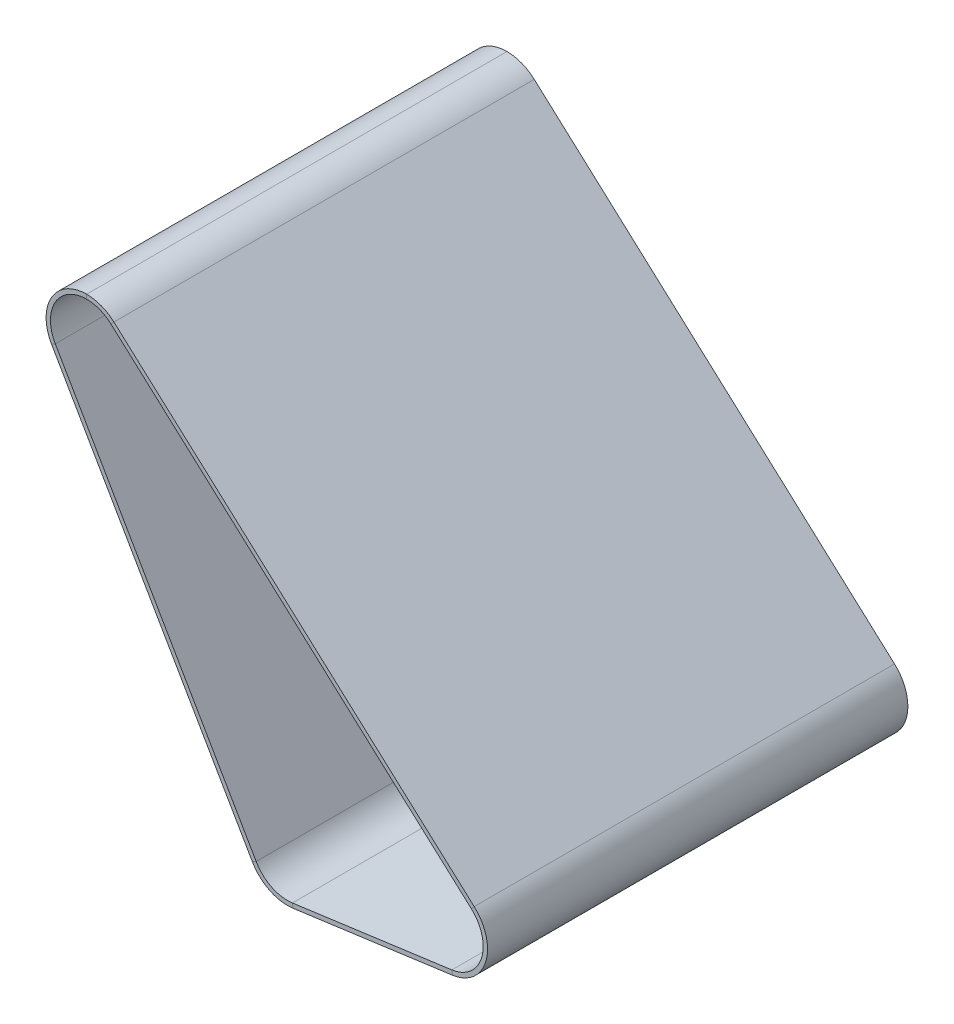
ISO-10303-21;
HEADER;
FILE_DESCRIPTION(('STEP AP214'),'2;1');
FILE_NAME('part.step','',(''),(''),'','','');
FILE_SCHEMA(('AUTOMOTIVE_DESIGN { 1 0 10303 214 1 1 1 1 }'));
ENDSEC;
DATA;
#1=APPLICATION_CONTEXT('core data for automotive mechanical design processes');
#2=APPLICATION_PROTOCOL_DEFINITION('international standard','automotive_design',2000,#1);
#3=PRODUCT_CONTEXT('',#1,'mechanical');
#4=PRODUCT('Part','Part','',(#3));
#5=PRODUCT_RELATED_PRODUCT_CATEGORY('part','',(#4));
#6=PRODUCT_DEFINITION_FORMATION('','',#4);
#7=PRODUCT_DEFINITION_CONTEXT('part definition',#1,'design');
#8=PRODUCT_DEFINITION('design','',#6,#7);
#9=PRODUCT_DEFINITION_SHAPE('','',#8);
#10=(LENGTH_UNIT() NAMED_UNIT(*) SI_UNIT(.MILLI.,.METRE.));
#11=(NAMED_UNIT(*) PLANE_ANGLE_UNIT() SI_UNIT($,.RADIAN.));
#12=(NAMED_UNIT(*) SI_UNIT($,.STERADIAN.) SOLID_ANGLE_UNIT());
#13=UNCERTAINTY_MEASURE_WITH_UNIT(LENGTH_MEASURE(1.E-05),#10,'distance_accuracy_value','');
#14=(GEOMETRIC_REPRESENTATION_CONTEXT(3) GLOBAL_UNCERTAINTY_ASSIGNED_CONTEXT((#13)) GLOBAL_UNIT_ASSIGNED_CONTEXT((#10,
#11,#12)) REPRESENTATION_CONTEXT('',''));
#15=CARTESIAN_POINT('',(0.,0.,0.));
#16=DIRECTION('',(0.,0.,1.));
#17=DIRECTION('',(1.,0.,0.));
#18=AXIS2_PLACEMENT_3D('',#15,#16,#17);
#19=CARTESIAN_POINT('',(-1.74860126378462E-12,1.38777878078145E-13,0.));
#20=DIRECTION('',(0.,0.,-1.));
#21=DIRECTION('',(-1.,0.,0.));
#22=AXIS2_PLACEMENT_3D('',#19,#20,#21);
#23=CYLINDRICAL_SURFACE('',#22,24.9999999999984);
#24=DIRECTION('',(0.,0.,-1.));
#25=VECTOR('',#24,1.);
#26=CARTESIAN_POINT('',(-21.6506350946114,-12.499999999999,145.));
#27=LINE('',#26,#25);
#28=CARTESIAN_POINT('',(-21.6506350946114,-12.499999999999,145.));
#29=VERTEX_POINT('',#28);
#30=CARTESIAN_POINT('',(-21.6506350946114,-12.499999999999,-145.));
#31=VERTEX_POINT('',#30);
#32=EDGE_CURVE('E178',#29,#31,#27,.T.);
#33=ORIENTED_EDGE('',*,*,#32,.T.);
#34=CARTESIAN_POINT('',(-1.74860126378462E-12,1.38777878078145E-13,-145.));
#35=DIRECTION('',(0.,0.,-1.));
#36=DIRECTION('',(-1.,0.,0.));
#37=AXIS2_PLACEMENT_3D('',#34,#35,#36);
#38=CIRCLE('',#37,24.9999999999984);
#39=CARTESIAN_POINT('',(0.,24.9999999999986,-145.));
#40=VERTEX_POINT('',#39);
#41=EDGE_CURVE('E46',#31,#40,#38,.T.);
#42=ORIENTED_EDGE('',*,*,#41,.T.);
#43=CARTESIAN_POINT('',(0.,24.9999999999986,145.));
#44=DIRECTION('',(0.,0.,-1.));
#45=VECTOR('',#44,1.);
#46=LINE('',#43,#45);
#47=CARTESIAN_POINT('',(0.,24.9999999999986,145.));
#48=VERTEX_POINT('',#47);
#49=EDGE_CURVE('E158',#48,#40,#46,.T.);
#50=ORIENTED_EDGE('',*,*,#49,.F.);
#51=CARTESIAN_POINT('',(-1.74860126378462E-12,1.38777878078145E-13,145.));
#52=DIRECTION('',(0.,0.,-1.));
#53=DIRECTION('',(-1.,0.,0.));
#54=AXIS2_PLACEMENT_3D('',#51,#52,#53);
#55=CIRCLE('',#54,24.9999999999984);
#56=EDGE_CURVE('E11',#29,#48,#55,.T.);
#57=ORIENTED_EDGE('',*,*,#56,.F.);
#58=EDGE_LOOP('',(#33,#42,#50,#57));
#59=FACE_BOUND('',#58,.T.);
#60=ADVANCED_FACE('F35',(#59),#23,.F.);
#61=CARTESIAN_POINT('',(-24.2487113059647,-13.9999999999992,-145.));
#62=DIRECTION('',(0.,0.,-1.));
#63=DIRECTION('',(-1.,0.,0.));
#64=AXIS2_PLACEMENT_3D('',#61,#62,#63);
#65=PLANE('',#64);
#66=DIRECTION('',(-0.866025403784405,-0.500000000000059,0.));
#67=VECTOR('',#66,1.);
#68=CARTESIAN_POINT('',(-24.2487113059647,-13.9999999999992,-145.));
#69=LINE('',#68,#67);
#70=CARTESIAN_POINT('',(-24.2487113059647,-13.9999999999992,-145.));
#71=VERTEX_POINT('',#70);
#72=EDGE_CURVE('E289',#31,#71,#69,.T.);
#73=ORIENTED_EDGE('',*,*,#72,.T.);
#74=CARTESIAN_POINT('',(-1.74860126378462E-12,1.38777878078145E-13,-145.));
#75=DIRECTION('',(0.,0.,-1.));
#76=DIRECTION('',(-1.,0.,0.));
#77=AXIS2_PLACEMENT_3D('',#74,#75,#76);
#78=CIRCLE('',#77,27.9999999999985);
#79=CARTESIAN_POINT('',(0.,27.9999999999986,-145.));
#80=VERTEX_POINT('',#79);
#81=EDGE_CURVE('E173',#71,#80,#78,.T.);
#82=ORIENTED_EDGE('',*,*,#81,.T.);
#83=CARTESIAN_POINT('',(0.,24.9999999999986,-145.));
#84=DIRECTION('',(0.,1.,0.));
#85=VECTOR('',#84,1.);
#86=LINE('',#83,#85);
#87=EDGE_CURVE('E147',#40,#80,#86,.T.);
#88=ORIENTED_EDGE('',*,*,#87,.F.);
#89=ORIENTED_EDGE('',*,*,#41,.F.);
#90=EDGE_LOOP('',(#73,#82,#88,#89));
#91=FACE_BOUND('',#90,.T.);
#92=ADVANCED_FACE('F171',(#91),#65,.T.);
#93=CARTESIAN_POINT('',(-1.74860126378462E-12,1.38777878078145E-13,0.));
#94=DIRECTION('',(0.,0.,-1.));
#95=DIRECTION('',(-1.,0.,0.));
#96=AXIS2_PLACEMENT_3D('',#93,#94,#95);
#97=CYLINDRICAL_SURFACE('',#96,27.9999999999985);
#98=DIRECTION('',(0.,0.,1.));
#99=VECTOR('',#98,1.);
#100=CARTESIAN_POINT('',(-24.2487113059648,-13.9999999999991,145.));
#101=LINE('',#100,#99);
#102=CARTESIAN_POINT('',(-24.2487113059648,-13.9999999999991,145.));
#103=VERTEX_POINT('',#102);
#104=EDGE_CURVE('E291',#71,#103,#101,.T.);
#105=ORIENTED_EDGE('',*,*,#104,.T.);
#106=CARTESIAN_POINT('',(-1.74860126378462E-12,1.38777878078145E-13,145.));
#107=DIRECTION('',(0.,0.,-1.));
#108=DIRECTION('',(-1.,0.,0.));
#109=AXIS2_PLACEMENT_3D('',#106,#107,#108);
#110=CIRCLE('',#109,27.9999999999985);
#111=CARTESIAN_POINT('',(1.00124713549987E-13,27.9999999999987,145.));
#112=VERTEX_POINT('',#111);
#113=EDGE_CURVE('E164',#103,#112,#110,.T.);
#114=ORIENTED_EDGE('',*,*,#113,.T.);
#115=CARTESIAN_POINT('',(0.,27.9999999999986,-145.));
#116=DIRECTION('',(0.,0.,1.));
#117=VECTOR('',#116,1.);
#118=LINE('',#115,#117);
#119=EDGE_CURVE('E174',#80,#112,#118,.T.);
#120=ORIENTED_EDGE('',*,*,#119,.F.);
#121=ORIENTED_EDGE('',*,*,#81,.F.);
#122=EDGE_LOOP('',(#105,#114,#120,#121));
#123=FACE_BOUND('',#122,.T.);
#124=ADVANCED_FACE('F212',(#123),#97,.T.);
#125=CARTESIAN_POINT('',(-24.2487113059648,-13.9999999999991,145.));
#126=DIRECTION('',(0.,0.,1.));
#127=DIRECTION('',(1.,0.,0.));
#128=AXIS2_PLACEMENT_3D('',#125,#126,#127);
#129=PLANE('',#128);
#130=DIRECTION('',(0.866025403784405,0.500000000000059,0.));
#131=VECTOR('',#130,1.);
#132=CARTESIAN_POINT('',(-24.2487113059648,-13.9999999999991,145.));
#133=LINE('',#132,#131);
#134=EDGE_CURVE('E294',#103,#29,#133,.T.);
#135=ORIENTED_EDGE('',*,*,#134,.T.);
#136=ORIENTED_EDGE('',*,*,#56,.T.);
#137=CARTESIAN_POINT('',(0.,27.9999999999986,145.));
#138=DIRECTION('',(0.,-1.,0.));
#139=VECTOR('',#138,1.);
#140=LINE('',#137,#139);
#141=EDGE_CURVE('E54',#112,#48,#140,.T.);
#142=ORIENTED_EDGE('',*,*,#141,.F.);
#143=ORIENTED_EDGE('',*,*,#113,.F.);
#144=EDGE_LOOP('',(#135,#136,#142,#143));
#145=FACE_BOUND('',#144,.T.);
#146=ADVANCED_FACE('F201',(#145),#129,.T.);
#147=CARTESIAN_POINT('',(116.913429510898,-252.5,145.));
#148=DIRECTION('',(0.866025403784441,0.499999999999997,0.));
#149=DIRECTION('',(-0.499999999999997,0.866025403784441,0.));
#150=AXIS2_PLACEMENT_3D('',#147,#148,#149);
#151=PLANE('',#150);
#152=DIRECTION('',(0.,0.,-1.));
#153=VECTOR('',#152,1.);
#154=CARTESIAN_POINT('',(116.913429510898,-252.5,145.));
#155=LINE('',#154,#153);
#156=CARTESIAN_POINT('',(116.913429510898,-252.5,145.));
#157=VERTEX_POINT('',#156);
#158=CARTESIAN_POINT('',(116.913429510898,-252.5,-145.));
#159=VERTEX_POINT('',#158);
#160=EDGE_CURVE('E309',#157,#159,#155,.T.);
#161=ORIENTED_EDGE('',*,*,#160,.T.);
#162=DIRECTION('',(-0.499999999999997,0.866025403784441,0.));
#163=VECTOR('',#162,1.);
#164=CARTESIAN_POINT('',(116.913429510898,-252.5,-145.));
#165=LINE('',#164,#163);
#166=EDGE_CURVE('E275',#159,#31,#165,.T.);
#167=ORIENTED_EDGE('',*,*,#166,.T.);
#168=ORIENTED_EDGE('',*,*,#32,.F.);
#169=DIRECTION('',(-0.499999999999997,0.866025403784441,0.));
#170=VECTOR('',#169,1.);
#171=CARTESIAN_POINT('',(116.913429510898,-252.5,145.));
#172=LINE('',#171,#170);
#173=EDGE_CURVE('E273',#157,#29,#172,.T.);
#174=ORIENTED_EDGE('',*,*,#173,.F.);
#175=EDGE_LOOP('',(#161,#167,#168,#174));
#176=FACE_BOUND('',#175,.T.);
#177=ADVANCED_FACE('F211',(#176),#151,.T.);
#178=CARTESIAN_POINT('',(114.315353299545,-254.,-145.));
#179=DIRECTION('',(0.,0.,-1.));
#180=DIRECTION('',(-1.,0.,0.));
#181=AXIS2_PLACEMENT_3D('',#178,#179,#180);
#182=PLANE('',#181);
#183=DIRECTION('',(-0.866025403784405,-0.500000000000059,0.));
#184=VECTOR('',#183,1.);
#185=CARTESIAN_POINT('',(114.315353299545,-254.,-145.));
#186=LINE('',#185,#184);
#187=CARTESIAN_POINT('',(114.315353299545,-254.,-145.));
#188=VERTEX_POINT('',#187);
#189=EDGE_CURVE('E312',#159,#188,#186,.T.);
#190=ORIENTED_EDGE('',*,*,#189,.T.);
#191=DIRECTION('',(-0.499999999999997,0.866025403784441,0.));
#192=VECTOR('',#191,1.);
#193=CARTESIAN_POINT('',(114.315353299545,-254.,-145.));
#194=LINE('',#193,#192);
#195=EDGE_CURVE('E280',#188,#71,#194,.T.);
#196=ORIENTED_EDGE('',*,*,#195,.T.);
#197=ORIENTED_EDGE('',*,*,#72,.F.);
#198=ORIENTED_EDGE('',*,*,#166,.F.);
#199=EDGE_LOOP('',(#190,#196,#197,#198));
#200=FACE_BOUND('',#199,.T.);
#201=ADVANCED_FACE('F448',(#200),#182,.T.);
#202=CARTESIAN_POINT('',(114.315353299545,-254.,145.));
#203=DIRECTION('',(-0.866025403784441,-0.499999999999997,0.));
#204=DIRECTION('',(0.499999999999997,-0.866025403784441,0.));
#205=AXIS2_PLACEMENT_3D('',#202,#203,#204);
#206=PLANE('',#205);
#207=DIRECTION('',(0.,0.,1.));
#208=VECTOR('',#207,1.);
#209=CARTESIAN_POINT('',(114.315353299545,-254.,145.));
#210=LINE('',#209,#208);
#211=CARTESIAN_POINT('',(114.315353299545,-254.,145.));
#212=VERTEX_POINT('',#211);
#213=EDGE_CURVE('E315',#188,#212,#210,.T.);
#214=ORIENTED_EDGE('',*,*,#213,.T.);
#215=DIRECTION('',(-0.499999999999997,0.866025403784441,0.));
#216=VECTOR('',#215,1.);
#217=CARTESIAN_POINT('',(114.315353299545,-254.,145.));
#218=LINE('',#217,#216);
#219=EDGE_CURVE('E285',#212,#103,#218,.T.);
#220=ORIENTED_EDGE('',*,*,#219,.T.);
#221=ORIENTED_EDGE('',*,*,#104,.F.);
#222=ORIENTED_EDGE('',*,*,#195,.F.);
#223=EDGE_LOOP('',(#214,#220,#221,#222));
#224=FACE_BOUND('',#223,.T.);
#225=ADVANCED_FACE('F450',(#224),#206,.T.);
#226=CARTESIAN_POINT('',(114.315353299545,-254.,145.));
#227=DIRECTION('',(0.,0.,1.));
#228=DIRECTION('',(1.,0.,0.));
#229=AXIS2_PLACEMENT_3D('',#226,#227,#228);
#230=PLANE('',#229);
#231=DIRECTION('',(0.866025403784405,0.500000000000059,0.));
#232=VECTOR('',#231,1.);
#233=CARTESIAN_POINT('',(114.315353299545,-254.,145.));
#234=LINE('',#233,#232);
#235=EDGE_CURVE('E318',#212,#157,#234,.T.);
#236=ORIENTED_EDGE('',*,*,#235,.T.);
#237=ORIENTED_EDGE('',*,*,#173,.T.);
#238=ORIENTED_EDGE('',*,*,#134,.F.);
#239=ORIENTED_EDGE('',*,*,#219,.F.);
#240=EDGE_LOOP('',(#236,#237,#238,#239));
#241=FACE_BOUND('',#240,.T.);
#242=ADVANCED_FACE('F452',(#241),#230,.T.);
#243=CARTESIAN_POINT('',(138.564064605508,-240.,0.));
#244=DIRECTION('',(0.,0.,-1.));
#245=DIRECTION('',(-1.,0.,0.));
#246=AXIS2_PLACEMENT_3D('',#243,#244,#245);
#247=CYLINDRICAL_SURFACE('',#246,24.9999999999984);
#248=DIRECTION('',(0.,0.,-1.));
#249=VECTOR('',#248,1.);
#250=CARTESIAN_POINT('',(141.94189472384,-264.770754201106,145.));
#251=LINE('',#250,#249);
#252=CARTESIAN_POINT('',(141.94189472384,-264.770754201106,145.));
#253=VERTEX_POINT('',#252);
#254=CARTESIAN_POINT('',(141.94189472384,-264.770754201106,-145.));
#255=VERTEX_POINT('',#254);
#256=EDGE_CURVE('E332',#253,#255,#251,.T.);
#257=ORIENTED_EDGE('',*,*,#256,.T.);
#258=CARTESIAN_POINT('',(138.564064605508,-240.,-145.));
#259=DIRECTION('',(0.,0.,-1.));
#260=DIRECTION('',(-1.,0.,0.));
#261=AXIS2_PLACEMENT_3D('',#258,#259,#260);
#262=CIRCLE('',#261,24.9999999999984);
#263=EDGE_CURVE('E300',#255,#159,#262,.T.);
#264=ORIENTED_EDGE('',*,*,#263,.T.);
#265=ORIENTED_EDGE('',*,*,#160,.F.);
#266=CARTESIAN_POINT('',(138.564064605508,-240.,145.));
#267=DIRECTION('',(0.,0.,-1.));
#268=DIRECTION('',(-1.,0.,0.));
#269=AXIS2_PLACEMENT_3D('',#266,#267,#268);
#270=CIRCLE('',#269,24.9999999999984);
#271=EDGE_CURVE('E297',#253,#157,#270,.T.);
#272=ORIENTED_EDGE('',*,*,#271,.F.);
#273=EDGE_LOOP('',(#257,#264,#265,#272));
#274=FACE_BOUND('',#273,.T.);
#275=ADVANCED_FACE('F442',(#274),#247,.F.);
#276=CARTESIAN_POINT('',(142.34723433804,-267.743244705239,-145.));
#277=DIRECTION('',(0.,0.,-1.));
#278=DIRECTION('',(-1.,0.,0.));
#279=AXIS2_PLACEMENT_3D('',#276,#277,#278);
#280=PLANE('',#279);
#281=DIRECTION('',(0.135113204733376,-0.990830168044291,0.));
#282=VECTOR('',#281,1.);
#283=CARTESIAN_POINT('',(142.34723433804,-267.743244705239,-145.));
#284=LINE('',#283,#282);
#285=CARTESIAN_POINT('',(142.34723433804,-267.743244705239,-145.));
#286=VERTEX_POINT('',#285);
#287=EDGE_CURVE('E335',#255,#286,#284,.T.);
#288=ORIENTED_EDGE('',*,*,#287,.T.);
#289=CARTESIAN_POINT('',(138.564064605508,-240.,-145.));
#290=DIRECTION('',(0.,0.,-1.));
#291=DIRECTION('',(-1.,0.,0.));
#292=AXIS2_PLACEMENT_3D('',#289,#290,#291);
#293=CIRCLE('',#292,27.9999999999985);
#294=EDGE_CURVE('E303',#286,#188,#293,.T.);
#295=ORIENTED_EDGE('',*,*,#294,.T.);
#296=ORIENTED_EDGE('',*,*,#189,.F.);
#297=ORIENTED_EDGE('',*,*,#263,.F.);
#298=EDGE_LOOP('',(#288,#295,#296,#297));
#299=FACE_BOUND('',#298,.T.);
#300=ADVANCED_FACE('F445',(#299),#280,.T.);
#301=CARTESIAN_POINT('',(138.564064605508,-240.,0.));
#302=DIRECTION('',(0.,0.,-1.));
#303=DIRECTION('',(-1.,0.,0.));
#304=AXIS2_PLACEMENT_3D('',#301,#302,#303);
#305=CYLINDRICAL_SURFACE('',#304,27.9999999999985);
#306=DIRECTION('',(0.,0.,1.));
#307=VECTOR('',#306,1.);
#308=CARTESIAN_POINT('',(142.34723433804,-267.743244705239,145.));
#309=LINE('',#308,#307);
#310=CARTESIAN_POINT('',(142.34723433804,-267.743244705239,145.));
#311=VERTEX_POINT('',#310);
#312=EDGE_CURVE('E338',#286,#311,#309,.T.);
#313=ORIENTED_EDGE('',*,*,#312,.T.);
#314=CARTESIAN_POINT('',(138.564064605508,-240.,145.));
#315=DIRECTION('',(0.,0.,-1.));
#316=DIRECTION('',(-1.,0.,0.));
#317=AXIS2_PLACEMENT_3D('',#314,#315,#316);
#318=CIRCLE('',#317,27.9999999999985);
#319=EDGE_CURVE('E306',#311,#212,#318,.T.);
#320=ORIENTED_EDGE('',*,*,#319,.T.);
#321=ORIENTED_EDGE('',*,*,#213,.F.);
#322=ORIENTED_EDGE('',*,*,#294,.F.);
#323=EDGE_LOOP('',(#313,#320,#321,#322));
#324=FACE_BOUND('',#323,.T.);
#325=ADVANCED_FACE('F436',(#324),#305,.T.);
#326=CARTESIAN_POINT('',(142.34723433804,-267.743244705239,145.));
#327=DIRECTION('',(0.,0.,1.));
#328=DIRECTION('',(1.,0.,0.));
#329=AXIS2_PLACEMENT_3D('',#326,#327,#328);
#330=PLANE('',#329);
#331=DIRECTION('',(-0.135113204733376,0.99083016804429,0.));
#332=VECTOR('',#331,1.);
#333=CARTESIAN_POINT('',(142.34723433804,-267.743244705239,145.));
#334=LINE('',#333,#332);
#335=EDGE_CURVE('E341',#311,#253,#334,.T.);
#336=ORIENTED_EDGE('',*,*,#335,.T.);
#337=ORIENTED_EDGE('',*,*,#271,.T.);
#338=ORIENTED_EDGE('',*,*,#235,.F.);
#339=ORIENTED_EDGE('',*,*,#319,.F.);
#340=EDGE_LOOP('',(#336,#337,#338,#339));
#341=FACE_BOUND('',#340,.T.);
#342=ADVANCED_FACE('F439',(#341),#330,.T.);
#343=CARTESIAN_POINT('',(251.941894723841,-249.770754201107,145.));
#344=DIRECTION('',(-0.135113204733305,0.9908301680443,0.));
#345=DIRECTION('',(-0.9908301680443,-0.135113204733305,0.));
#346=AXIS2_PLACEMENT_3D('',#343,#344,#345);
#347=PLANE('',#346);
#348=DIRECTION('',(0.,0.,-1.));
#349=VECTOR('',#348,1.);
#350=CARTESIAN_POINT('',(251.941894723841,-249.770754201107,145.));
#351=LINE('',#350,#349);
#352=CARTESIAN_POINT('',(251.941894723841,-249.770754201107,145.));
#353=VERTEX_POINT('',#352);
#354=CARTESIAN_POINT('',(251.941894723841,-249.770754201107,-145.));
#355=VERTEX_POINT('',#354);
#356=EDGE_CURVE('E356',#353,#355,#351,.T.);
#357=ORIENTED_EDGE('',*,*,#356,.T.);
#358=DIRECTION('',(-0.9908301680443,-0.135113204733305,0.));
#359=VECTOR('',#358,1.);
#360=CARTESIAN_POINT('',(251.941894723841,-249.770754201107,-145.));
#361=LINE('',#360,#359);
#362=EDGE_CURVE('E323',#355,#255,#361,.T.);
#363=ORIENTED_EDGE('',*,*,#362,.T.);
#364=ORIENTED_EDGE('',*,*,#256,.F.);
#365=DIRECTION('',(-0.9908301680443,-0.135113204733305,0.));
#366=VECTOR('',#365,1.);
#367=CARTESIAN_POINT('',(251.941894723841,-249.770754201107,145.));
#368=LINE('',#367,#366);
#369=EDGE_CURVE('E320',#353,#253,#368,.T.);
#370=ORIENTED_EDGE('',*,*,#369,.F.);
#371=EDGE_LOOP('',(#357,#363,#364,#370));
#372=FACE_BOUND('',#371,.T.);
#373=ADVANCED_FACE('F427',(#372),#347,.T.);
#374=CARTESIAN_POINT('',(252.347234338041,-252.74324470524,-145.));
#375=DIRECTION('',(0.,0.,-1.));
#376=DIRECTION('',(-1.,0.,0.));
#377=AXIS2_PLACEMENT_3D('',#374,#375,#376);
#378=PLANE('',#377);
#379=DIRECTION('',(0.135113204733376,-0.990830168044291,0.));
#380=VECTOR('',#379,1.);
#381=CARTESIAN_POINT('',(252.347234338041,-252.74324470524,-145.));
#382=LINE('',#381,#380);
#383=CARTESIAN_POINT('',(252.347234338041,-252.74324470524,-145.));
#384=VERTEX_POINT('',#383);
#385=EDGE_CURVE('E359',#355,#384,#382,.T.);
#386=ORIENTED_EDGE('',*,*,#385,.T.);
#387=DIRECTION('',(-0.9908301680443,-0.135113204733305,0.));
#388=VECTOR('',#387,1.);
#389=CARTESIAN_POINT('',(252.347234338041,-252.74324470524,-145.));
#390=LINE('',#389,#388);
#391=EDGE_CURVE('E326',#384,#286,#390,.T.);
#392=ORIENTED_EDGE('',*,*,#391,.T.);
#393=ORIENTED_EDGE('',*,*,#287,.F.);
#394=ORIENTED_EDGE('',*,*,#362,.F.);
#395=EDGE_LOOP('',(#386,#392,#393,#394));
#396=FACE_BOUND('',#395,.T.);
#397=ADVANCED_FACE('F430',(#396),#378,.T.);
#398=CARTESIAN_POINT('',(252.347234338041,-252.74324470524,145.));
#399=DIRECTION('',(0.135113204733305,-0.9908301680443,0.));
#400=DIRECTION('',(0.9908301680443,0.135113204733305,0.));
#401=AXIS2_PLACEMENT_3D('',#398,#399,#400);
#402=PLANE('',#401);
#403=DIRECTION('',(0.,0.,1.));
#404=VECTOR('',#403,1.);
#405=CARTESIAN_POINT('',(252.347234338041,-252.74324470524,145.));
#406=LINE('',#405,#404);
#407=CARTESIAN_POINT('',(252.347234338041,-252.74324470524,145.));
#408=VERTEX_POINT('',#407);
#409=EDGE_CURVE('E362',#384,#408,#406,.T.);
#410=ORIENTED_EDGE('',*,*,#409,.T.);
#411=DIRECTION('',(-0.9908301680443,-0.135113204733305,0.));
#412=VECTOR('',#411,1.);
#413=CARTESIAN_POINT('',(252.347234338041,-252.74324470524,145.));
#414=LINE('',#413,#412);
#415=EDGE_CURVE('E329',#408,#311,#414,.T.);
#416=ORIENTED_EDGE('',*,*,#415,.T.);
#417=ORIENTED_EDGE('',*,*,#312,.F.);
#418=ORIENTED_EDGE('',*,*,#391,.F.);
#419=EDGE_LOOP('',(#410,#416,#417,#418));
#420=FACE_BOUND('',#419,.T.);
#421=ADVANCED_FACE('F433',(#420),#402,.T.);
#422=CARTESIAN_POINT('',(252.347234338041,-252.74324470524,145.));
#423=DIRECTION('',(0.,0.,1.));
#424=DIRECTION('',(1.,0.,0.));
#425=AXIS2_PLACEMENT_3D('',#422,#423,#424);
#426=PLANE('',#425);
#427=DIRECTION('',(-0.135113204733376,0.99083016804429,0.));
#428=VECTOR('',#427,1.);
#429=CARTESIAN_POINT('',(252.347234338041,-252.74324470524,145.));
#430=LINE('',#429,#428);
#431=EDGE_CURVE('E365',#408,#353,#430,.T.);
#432=ORIENTED_EDGE('',*,*,#431,.T.);
#433=ORIENTED_EDGE('',*,*,#369,.T.);
#434=ORIENTED_EDGE('',*,*,#335,.F.);
#435=ORIENTED_EDGE('',*,*,#415,.F.);
#436=EDGE_LOOP('',(#432,#433,#434,#435));
#437=FACE_BOUND('',#436,.T.);
#438=ADVANCED_FACE('F424',(#437),#426,.T.);
#439=CARTESIAN_POINT('',(248.564064605509,-225.000000000001,0.));
#440=DIRECTION('',(0.,0.,-1.));
#441=DIRECTION('',(-1.,0.,0.));
#442=AXIS2_PLACEMENT_3D('',#439,#440,#441);
#443=CYLINDRICAL_SURFACE('',#442,24.9999999999984);
#444=DIRECTION('',(0.,0.,-1.));
#445=VECTOR('',#444,1.);
#446=CARTESIAN_POINT('',(265.341354263163,-206.465638620577,145.));
#447=LINE('',#446,#445);
#448=CARTESIAN_POINT('',(265.341354263163,-206.465638620577,145.));
#449=VERTEX_POINT('',#448);
#450=CARTESIAN_POINT('',(265.341354263163,-206.465638620577,-145.));
#451=VERTEX_POINT('',#450);
#452=EDGE_CURVE('E380',#449,#451,#447,.T.);
#453=ORIENTED_EDGE('',*,*,#452,.T.);
#454=CARTESIAN_POINT('',(248.564064605509,-225.000000000001,-145.));
#455=DIRECTION('',(0.,0.,-1.));
#456=DIRECTION('',(-1.,0.,0.));
#457=AXIS2_PLACEMENT_3D('',#454,#455,#456);
#458=CIRCLE('',#457,24.9999999999984);
#459=EDGE_CURVE('E347',#451,#355,#458,.T.);
#460=ORIENTED_EDGE('',*,*,#459,.T.);
#461=ORIENTED_EDGE('',*,*,#356,.F.);
#462=CARTESIAN_POINT('',(248.564064605509,-225.000000000001,145.));
#463=DIRECTION('',(0.,0.,-1.));
#464=DIRECTION('',(-1.,0.,0.));
#465=AXIS2_PLACEMENT_3D('',#462,#463,#464);
#466=CIRCLE('',#465,24.9999999999984);
#467=EDGE_CURVE('E344',#449,#353,#466,.T.);
#468=ORIENTED_EDGE('',*,*,#467,.F.);
#469=EDGE_LOOP('',(#453,#460,#461,#468));
#470=FACE_BOUND('',#469,.T.);
#471=ADVANCED_FACE('F407',(#470),#443,.F.);
#472=CARTESIAN_POINT('',(267.354629022081,-204.241515255046,-145.));
#473=DIRECTION('',(0.,0.,-1.));
#474=DIRECTION('',(-1.,0.,0.));
#475=AXIS2_PLACEMENT_3D('',#472,#473,#474);
#476=PLANE('',#475);
#477=DIRECTION('',(0.671091586306153,0.741374455177066,0.));
#478=VECTOR('',#477,1.);
#479=CARTESIAN_POINT('',(267.354629022081,-204.241515255046,-145.));
#480=LINE('',#479,#478);
#481=CARTESIAN_POINT('',(267.354629022081,-204.241515255046,-145.));
#482=VERTEX_POINT('',#481);
#483=EDGE_CURVE('E383',#451,#482,#480,.T.);
#484=ORIENTED_EDGE('',*,*,#483,.T.);
#485=CARTESIAN_POINT('',(248.564064605509,-225.000000000001,-145.));
#486=DIRECTION('',(0.,0.,-1.));
#487=DIRECTION('',(-1.,0.,0.));
#488=AXIS2_PLACEMENT_3D('',#485,#486,#487);
#489=CIRCLE('',#488,27.9999999999984);
#490=EDGE_CURVE('E350',#482,#384,#489,.T.);
#491=ORIENTED_EDGE('',*,*,#490,.T.);
#492=ORIENTED_EDGE('',*,*,#385,.F.);
#493=ORIENTED_EDGE('',*,*,#459,.F.);
#494=EDGE_LOOP('',(#484,#491,#492,#493));
#495=FACE_BOUND('',#494,.T.);
#496=ADVANCED_FACE('F413',(#495),#476,.T.);
#497=CARTESIAN_POINT('',(248.564064605509,-225.000000000001,0.));
#498=DIRECTION('',(0.,0.,-1.));
#499=DIRECTION('',(-1.,0.,0.));
#500=AXIS2_PLACEMENT_3D('',#497,#498,#499);
#501=CYLINDRICAL_SURFACE('',#500,27.9999999999985);
#502=DIRECTION('',(0.,0.,1.));
#503=VECTOR('',#502,1.);
#504=CARTESIAN_POINT('',(267.354629022081,-204.241515255046,145.));
#505=LINE('',#504,#503);
#506=CARTESIAN_POINT('',(267.354629022081,-204.241515255046,145.));
#507=VERTEX_POINT('',#506);
#508=EDGE_CURVE('E386',#482,#507,#505,.T.);
#509=ORIENTED_EDGE('',*,*,#508,.T.);
#510=CARTESIAN_POINT('',(248.564064605509,-225.000000000001,145.));
#511=DIRECTION('',(0.,0.,-1.));
#512=DIRECTION('',(-1.,0.,0.));
#513=AXIS2_PLACEMENT_3D('',#510,#511,#512);
#514=CIRCLE('',#513,27.9999999999985);
#515=EDGE_CURVE('E353',#507,#408,#514,.T.);
#516=ORIENTED_EDGE('',*,*,#515,.T.);
#517=ORIENTED_EDGE('',*,*,#409,.F.);
#518=ORIENTED_EDGE('',*,*,#490,.F.);
#519=EDGE_LOOP('',(#509,#516,#517,#518));
#520=FACE_BOUND('',#519,.T.);
#521=ADVANCED_FACE('F418',(#520),#501,.T.);
#522=CARTESIAN_POINT('',(267.354629022081,-204.241515255046,145.));
#523=DIRECTION('',(0.,0.,1.));
#524=DIRECTION('',(1.,0.,0.));
#525=AXIS2_PLACEMENT_3D('',#522,#523,#524);
#526=PLANE('',#525);
#527=DIRECTION('',(-0.671091586306153,-0.741374455177066,0.));
#528=VECTOR('',#527,1.);
#529=CARTESIAN_POINT('',(267.354629022081,-204.241515255046,145.));
#530=LINE('',#529,#528);
#531=EDGE_CURVE('E230',#507,#449,#530,.T.);
#532=ORIENTED_EDGE('',*,*,#531,.T.);
#533=ORIENTED_EDGE('',*,*,#467,.T.);
#534=ORIENTED_EDGE('',*,*,#431,.F.);
#535=ORIENTED_EDGE('',*,*,#515,.F.);
#536=EDGE_LOOP('',(#532,#533,#534,#535));
#537=FACE_BOUND('',#536,.T.);
#538=ADVANCED_FACE('F421',(#537),#526,.T.);
#539=CARTESIAN_POINT('',(16.7772896576523,18.5343613794245,145.));
#540=DIRECTION('',(-0.671091586306205,-0.741374455177018,0.));
#541=DIRECTION('',(0.741374455177018,-0.671091586306205,0.));
#542=AXIS2_PLACEMENT_3D('',#539,#540,#541);
#543=PLANE('',#542);
#544=DIRECTION('',(0.,0.,-1.));
#545=VECTOR('',#544,1.);
#546=CARTESIAN_POINT('',(16.7772896576523,18.5343613794245,145.));
#547=LINE('',#546,#545);
#548=CARTESIAN_POINT('',(16.7772896576523,18.5343613794245,145.));
#549=VERTEX_POINT('',#548);
#550=CARTESIAN_POINT('',(16.7772896576523,18.5343613794245,-145.));
#551=VERTEX_POINT('',#550);
#552=EDGE_CURVE('E395',#549,#551,#547,.T.);
#553=ORIENTED_EDGE('',*,*,#552,.T.);
#554=DIRECTION('',(0.741374455177018,-0.671091586306205,0.));
#555=VECTOR('',#554,1.);
#556=CARTESIAN_POINT('',(16.7772896576523,18.5343613794245,-145.));
#557=LINE('',#556,#555);
#558=EDGE_CURVE('E371',#551,#451,#557,.T.);
#559=ORIENTED_EDGE('',*,*,#558,.T.);
#560=ORIENTED_EDGE('',*,*,#452,.F.);
#561=DIRECTION('',(0.741374455177018,-0.671091586306205,0.));
#562=VECTOR('',#561,1.);
#563=CARTESIAN_POINT('',(16.7772896576523,18.5343613794245,145.));
#564=LINE('',#563,#562);
#565=EDGE_CURVE('E368',#549,#449,#564,.T.);
#566=ORIENTED_EDGE('',*,*,#565,.F.);
#567=EDGE_LOOP('',(#553,#559,#560,#566));
#568=FACE_BOUND('',#567,.T.);
#569=ADVANCED_FACE('F403',(#568),#543,.T.);
#570=CARTESIAN_POINT('',(18.7905644165708,20.7584847449557,-145.));
#571=DIRECTION('',(0.,0.,-1.));
#572=DIRECTION('',(-1.,0.,0.));
#573=AXIS2_PLACEMENT_3D('',#570,#571,#572);
#574=PLANE('',#573);
#575=DIRECTION('',(0.671091586306153,0.741374455177066,0.));
#576=VECTOR('',#575,1.);
#577=CARTESIAN_POINT('',(18.7905644165708,20.7584847449557,-145.));
#578=LINE('',#577,#576);
#579=CARTESIAN_POINT('',(18.7905644165708,20.7584847449557,-145.));
#580=VERTEX_POINT('',#579);
#581=EDGE_CURVE('E151',#551,#580,#578,.T.);
#582=ORIENTED_EDGE('',*,*,#581,.T.);
#583=DIRECTION('',(0.741374455177018,-0.671091586306205,0.));
#584=VECTOR('',#583,1.);
#585=CARTESIAN_POINT('',(18.7905644165708,20.7584847449557,-145.));
#586=LINE('',#585,#584);
#587=EDGE_CURVE('E374',#580,#482,#586,.T.);
#588=ORIENTED_EDGE('',*,*,#587,.T.);
#589=ORIENTED_EDGE('',*,*,#483,.F.);
#590=ORIENTED_EDGE('',*,*,#558,.F.);
#591=EDGE_LOOP('',(#582,#588,#589,#590));
#592=FACE_BOUND('',#591,.T.);
#593=ADVANCED_FACE('F410',(#592),#574,.T.);
#594=CARTESIAN_POINT('',(18.7905644165708,20.7584847449557,145.));
#595=DIRECTION('',(0.671091586306205,0.741374455177018,0.));
#596=DIRECTION('',(-0.741374455177018,0.671091586306205,0.));
#597=AXIS2_PLACEMENT_3D('',#594,#595,#596);
#598=PLANE('',#597);
#599=DIRECTION('',(0.,0.,1.));
#600=VECTOR('',#599,1.);
#601=CARTESIAN_POINT('',(18.7905644165708,20.7584847449557,145.));
#602=LINE('',#601,#600);
#603=CARTESIAN_POINT('',(18.7905644165708,20.7584847449557,145.));
#604=VERTEX_POINT('',#603);
#605=EDGE_CURVE('E391',#580,#604,#602,.T.);
#606=ORIENTED_EDGE('',*,*,#605,.T.);
#607=DIRECTION('',(0.741374455177018,-0.671091586306205,0.));
#608=VECTOR('',#607,1.);
#609=CARTESIAN_POINT('',(18.7905644165708,20.7584847449557,145.));
#610=LINE('',#609,#608);
#611=EDGE_CURVE('E377',#604,#507,#610,.T.);
#612=ORIENTED_EDGE('',*,*,#611,.T.);
#613=ORIENTED_EDGE('',*,*,#508,.F.);
#614=ORIENTED_EDGE('',*,*,#587,.F.);
#615=EDGE_LOOP('',(#606,#612,#613,#614));
#616=FACE_BOUND('',#615,.T.);
#617=ADVANCED_FACE('F416',(#616),#598,.T.);
#618=CARTESIAN_POINT('',(18.7905644165708,20.7584847449557,145.));
#619=DIRECTION('',(0.,0.,1.));
#620=DIRECTION('',(1.,0.,0.));
#621=AXIS2_PLACEMENT_3D('',#618,#619,#620);
#622=PLANE('',#621);
#623=DIRECTION('',(-0.671091586306153,-0.741374455177066,0.));
#624=VECTOR('',#623,1.);
#625=CARTESIAN_POINT('',(18.7905644165708,20.7584847449557,145.));
#626=LINE('',#625,#624);
#627=EDGE_CURVE('E398',#604,#549,#626,.T.);
#628=ORIENTED_EDGE('',*,*,#627,.T.);
#629=ORIENTED_EDGE('',*,*,#565,.T.);
#630=ORIENTED_EDGE('',*,*,#531,.F.);
#631=ORIENTED_EDGE('',*,*,#611,.F.);
#632=EDGE_LOOP('',(#628,#629,#630,#631));
#633=FACE_BOUND('',#632,.T.);
#634=ADVANCED_FACE('F246',(#633),#622,.T.);
#635=CARTESIAN_POINT('',(18.7905644165708,20.7584847449557,145.));
#636=DIRECTION('',(0.,0.,-1.));
#637=DIRECTION('',(-1.,0.,0.));
#638=AXIS2_PLACEMENT_3D('',#635,#636,#637);
#639=PLANE('',#638);
#640=CARTESIAN_POINT('',(-1.74860126378462E-12,1.38777878078145E-13,145.));
#641=DIRECTION('',(0.,0.,1.));
#642=DIRECTION('',(1.,0.,0.));
#643=AXIS2_PLACEMENT_3D('',#640,#641,#642);
#644=CIRCLE('',#643,24.9999999999984);
#645=EDGE_CURVE('E154',#549,#48,#644,.T.);
#646=ORIENTED_EDGE('',*,*,#645,.F.);
#647=ORIENTED_EDGE('',*,*,#627,.F.);
#648=CARTESIAN_POINT('',(-1.74860126378462E-12,1.38777878078145E-13,145.));
#649=DIRECTION('',(0.,0.,1.));
#650=DIRECTION('',(1.,0.,0.));
#651=AXIS2_PLACEMENT_3D('',#648,#649,#650);
#652=CIRCLE('',#651,27.9999999999985);
#653=EDGE_CURVE('E237',#604,#112,#652,.T.);
#654=ORIENTED_EDGE('',*,*,#653,.T.);
#655=ORIENTED_EDGE('',*,*,#141,.T.);
#656=EDGE_LOOP('',(#646,#647,#654,#655));
#657=FACE_BOUND('',#656,.T.);
#658=ADVANCED_FACE('F238',(#657),#639,.F.);
#659=CARTESIAN_POINT('',(-1.74860126378462E-12,1.38777878078145E-13,0.));
#660=DIRECTION('',(0.,0.,1.));
#661=DIRECTION('',(1.,0.,0.));
#662=AXIS2_PLACEMENT_3D('',#659,#660,#661);
#663=CYLINDRICAL_SURFACE('',#662,24.9999999999984);
#664=CARTESIAN_POINT('',(-1.74860126378462E-12,1.38777878078145E-13,-145.));
#665=DIRECTION('',(0.,0.,1.));
#666=DIRECTION('',(1.,0.,0.));
#667=AXIS2_PLACEMENT_3D('',#664,#665,#666);
#668=CIRCLE('',#667,24.9999999999984);
#669=EDGE_CURVE('E142',#551,#40,#668,.T.);
#670=ORIENTED_EDGE('',*,*,#669,.F.);
#671=ORIENTED_EDGE('',*,*,#552,.F.);
#672=ORIENTED_EDGE('',*,*,#645,.T.);
#673=ORIENTED_EDGE('',*,*,#49,.T.);
#674=EDGE_LOOP('',(#670,#671,#672,#673));
#675=FACE_BOUND('',#674,.T.);
#676=ADVANCED_FACE('F160',(#675),#663,.F.);
#677=CARTESIAN_POINT('',(18.7905644165708,20.7584847449557,-145.));
#678=DIRECTION('',(0.,0.,1.));
#679=DIRECTION('',(1.,0.,0.));
#680=AXIS2_PLACEMENT_3D('',#677,#678,#679);
#681=PLANE('',#680);
#682=CARTESIAN_POINT('',(-1.74860126378462E-12,1.38777878078145E-13,-145.));
#683=DIRECTION('',(0.,0.,1.));
#684=DIRECTION('',(1.,0.,0.));
#685=AXIS2_PLACEMENT_3D('',#682,#683,#684);
#686=CIRCLE('',#685,27.9999999999984);
#687=EDGE_CURVE('E155',#580,#80,#686,.T.);
#688=ORIENTED_EDGE('',*,*,#687,.F.);
#689=ORIENTED_EDGE('',*,*,#581,.F.);
#690=ORIENTED_EDGE('',*,*,#669,.T.);
#691=ORIENTED_EDGE('',*,*,#87,.T.);
#692=EDGE_LOOP('',(#688,#689,#690,#691));
#693=FACE_BOUND('',#692,.T.);
#694=ADVANCED_FACE('F145',(#693),#681,.F.);
#695=CARTESIAN_POINT('',(-1.74860126378462E-12,1.38777878078145E-13,0.));
#696=DIRECTION('',(0.,0.,1.));
#697=DIRECTION('',(1.,0.,0.));
#698=AXIS2_PLACEMENT_3D('',#695,#696,#697);
#699=CYLINDRICAL_SURFACE('',#698,27.9999999999985);
#700=ORIENTED_EDGE('',*,*,#605,.F.);
#701=ORIENTED_EDGE('',*,*,#687,.T.);
#702=ORIENTED_EDGE('',*,*,#119,.T.);
#703=ORIENTED_EDGE('',*,*,#653,.F.);
#704=EDGE_LOOP('',(#700,#701,#702,#703));
#705=FACE_BOUND('',#704,.T.);
#706=ADVANCED_FACE('F247',(#705),#699,.T.);
#707=CLOSED_SHELL('',(#60,#92,#124,#146,#177,#201,#225,#242,#275,#300,#325,#342,#373,#397,#421,
#438,#471,#496,#521,#538,#569,#593,#617,#634,#658,#676,#694,#706));
#708=MANIFOLD_SOLID_BREP('B2',#707);
#709=ADVANCED_BREP_SHAPE_REPRESENTATION('',(#18,#708),#14);
#710=SHAPE_DEFINITION_REPRESENTATION(#9,#709);
ENDSEC;
END-ISO-10303-21;
